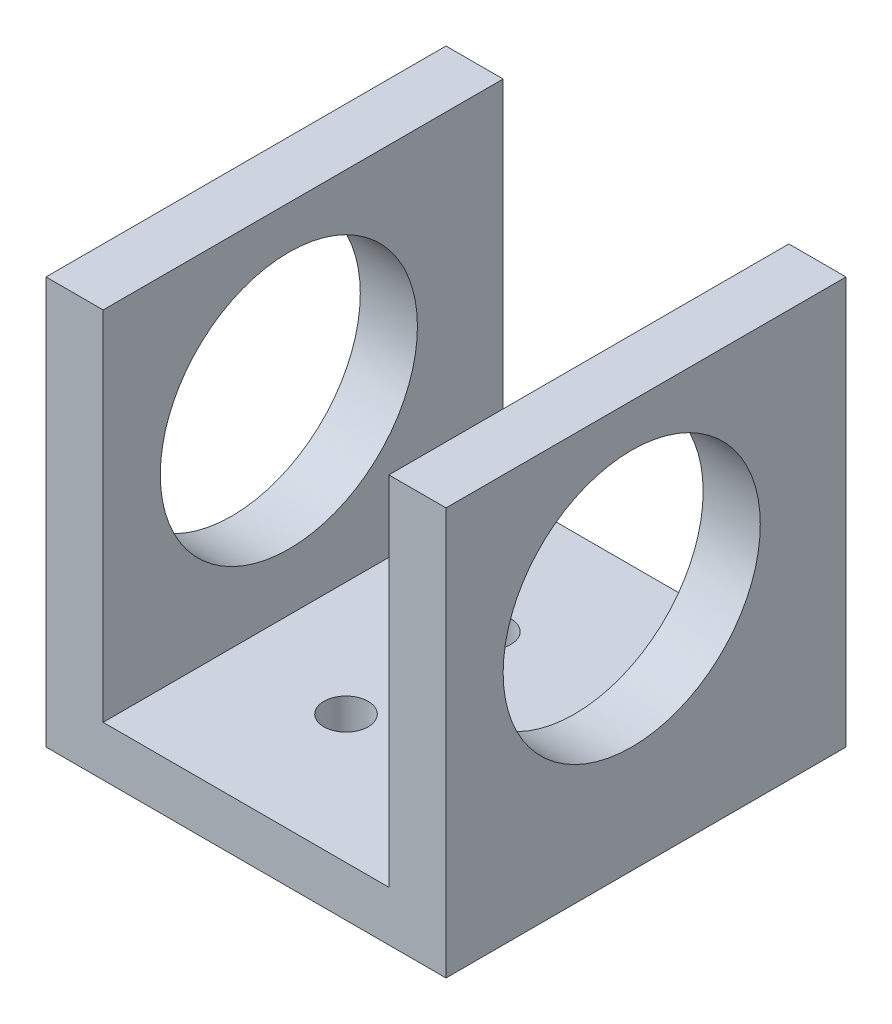
ISO-10303-21;
HEADER;
FILE_DESCRIPTION(('STEP AP214'),'2;1');
FILE_NAME('part.step','',(''),(''),'','','');
FILE_SCHEMA(('AUTOMOTIVE_DESIGN { 1 0 10303 214 1 1 1 1 }'));
ENDSEC;
DATA;
#1=APPLICATION_CONTEXT('core data for automotive mechanical design processes');
#2=APPLICATION_PROTOCOL_DEFINITION('international standard','automotive_design',2000,#1);
#3=PRODUCT_CONTEXT('',#1,'mechanical');
#4=PRODUCT('Part','Part','',(#3));
#5=PRODUCT_RELATED_PRODUCT_CATEGORY('part','',(#4));
#6=PRODUCT_DEFINITION_FORMATION('','',#4);
#7=PRODUCT_DEFINITION_CONTEXT('part definition',#1,'design');
#8=PRODUCT_DEFINITION('design','',#6,#7);
#9=PRODUCT_DEFINITION_SHAPE('','',#8);
#10=(LENGTH_UNIT() NAMED_UNIT(*) SI_UNIT(.MILLI.,.METRE.));
#11=(NAMED_UNIT(*) PLANE_ANGLE_UNIT() SI_UNIT($,.RADIAN.));
#12=(NAMED_UNIT(*) SI_UNIT($,.STERADIAN.) SOLID_ANGLE_UNIT());
#13=UNCERTAINTY_MEASURE_WITH_UNIT(LENGTH_MEASURE(1.E-05),#10,'distance_accuracy_value','');
#14=(GEOMETRIC_REPRESENTATION_CONTEXT(3) GLOBAL_UNCERTAINTY_ASSIGNED_CONTEXT((#13)) GLOBAL_UNIT_ASSIGNED_CONTEXT((#10,
#11,#12)) REPRESENTATION_CONTEXT('',''));
#15=CARTESIAN_POINT('',(0.,0.,0.));
#16=DIRECTION('',(0.,0.,1.));
#17=DIRECTION('',(1.,0.,0.));
#18=AXIS2_PLACEMENT_3D('',#15,#16,#17);
#19=CARTESIAN_POINT('',(0.,3.5,0.));
#20=DIRECTION('',(0.,1.,0.));
#21=DIRECTION('',(0.,0.,1.));
#22=AXIS2_PLACEMENT_3D('',#19,#20,#21);
#23=PLANE('',#22);
#24=CARTESIAN_POINT('',(12.,3.5,19.));
#25=DIRECTION('',(0.,1.,0.));
#26=DIRECTION('',(0.,0.,1.));
#27=AXIS2_PLACEMENT_3D('',#24,#25,#26);
#28=CIRCLE('',#27,1.55);
#29=CARTESIAN_POINT('',(12.,3.5,20.55));
#30=VERTEX_POINT('',#29);
#31=EDGE_CURVE('E178',#30,#30,#28,.T.);
#32=ORIENTED_EDGE('',*,*,#31,.F.);
#33=EDGE_LOOP('',(#32));
#34=FACE_BOUND('',#33,.T.);
#35=CARTESIAN_POINT('',(12.,3.5,9.));
#36=DIRECTION('',(0.,1.,0.));
#37=DIRECTION('',(0.,0.,1.));
#38=AXIS2_PLACEMENT_3D('',#35,#36,#37);
#39=CIRCLE('',#38,1.55);
#40=CARTESIAN_POINT('',(12.,3.5,10.55));
#41=VERTEX_POINT('',#40);
#42=EDGE_CURVE('E183',#41,#41,#39,.T.);
#43=ORIENTED_EDGE('',*,*,#42,.F.);
#44=EDGE_LOOP('',(#43));
#45=FACE_BOUND('',#44,.T.);
#46=DIRECTION('',(1.,0.,0.));
#47=VECTOR('',#46,1.);
#48=CARTESIAN_POINT('',(0.,3.5,28.));
#49=LINE('',#48,#47);
#50=CARTESIAN_POINT('',(4.,3.5,28.));
#51=VERTEX_POINT('',#50);
#52=CARTESIAN_POINT('',(24.,3.5,28.));
#53=VERTEX_POINT('',#52);
#54=EDGE_CURVE('E59',#51,#53,#49,.T.);
#55=ORIENTED_EDGE('',*,*,#54,.T.);
#56=DIRECTION('',(0.,0.,1.));
#57=VECTOR('',#56,1.);
#58=CARTESIAN_POINT('',(24.,3.5,0.));
#59=LINE('',#58,#57);
#60=CARTESIAN_POINT('',(24.,3.5,0.));
#61=VERTEX_POINT('',#60);
#62=EDGE_CURVE('E54',#61,#53,#59,.T.);
#63=ORIENTED_EDGE('',*,*,#62,.F.);
#64=DIRECTION('',(-1.,0.,0.));
#65=VECTOR('',#64,1.);
#66=CARTESIAN_POINT('',(0.,3.5,0.));
#67=LINE('',#66,#65);
#68=CARTESIAN_POINT('',(4.,3.5,0.));
#69=VERTEX_POINT('',#68);
#70=EDGE_CURVE('E160',#61,#69,#67,.T.);
#71=ORIENTED_EDGE('',*,*,#70,.T.);
#72=DIRECTION('',(0.,0.,-1.));
#73=VECTOR('',#72,1.);
#74=CARTESIAN_POINT('',(4.,3.5,0.));
#75=LINE('',#74,#73);
#76=EDGE_CURVE('E139',#51,#69,#75,.T.);
#77=ORIENTED_EDGE('',*,*,#76,.F.);
#78=EDGE_LOOP('',(#55,#63,#71,#77));
#79=FACE_BOUND('',#78,.T.);
#80=ADVANCED_FACE('F37',(#34,#45,#79),#23,.T.);
#81=CARTESIAN_POINT('',(0.,3.5,0.));
#82=DIRECTION('',(1.,0.,0.));
#83=DIRECTION('',(0.,0.,-1.));
#84=AXIS2_PLACEMENT_3D('',#81,#82,#83);
#85=PLANE('',#84);
#86=CARTESIAN_POINT('',(0.,16.5,15.));
#87=DIRECTION('',(-1.,0.,0.));
#88=DIRECTION('',(0.,0.,1.));
#89=AXIS2_PLACEMENT_3D('',#86,#87,#88);
#90=CIRCLE('',#89,9.);
#91=CARTESIAN_POINT('',(0.,16.5,24.));
#92=VERTEX_POINT('',#91);
#93=EDGE_CURVE('E175',#92,#92,#90,.T.);
#94=ORIENTED_EDGE('',*,*,#93,.F.);
#95=EDGE_LOOP('',(#94));
#96=FACE_BOUND('',#95,.T.);
#97=DIRECTION('',(0.,0.,1.));
#98=VECTOR('',#97,1.);
#99=CARTESIAN_POINT('',(0.,0.,0.));
#100=LINE('',#99,#98);
#101=CARTESIAN_POINT('',(0.,0.,0.));
#102=VERTEX_POINT('',#101);
#103=CARTESIAN_POINT('',(0.,0.,28.));
#104=VERTEX_POINT('',#103);
#105=EDGE_CURVE('E158',#102,#104,#100,.T.);
#106=ORIENTED_EDGE('',*,*,#105,.T.);
#107=DIRECTION('',(0.,-1.,0.));
#108=VECTOR('',#107,1.);
#109=CARTESIAN_POINT('',(0.,3.5,28.));
#110=LINE('',#109,#108);
#111=CARTESIAN_POINT('',(0.,28.5,28.));
#112=VERTEX_POINT('',#111);
#113=EDGE_CURVE('E11',#112,#104,#110,.T.);
#114=ORIENTED_EDGE('',*,*,#113,.F.);
#115=DIRECTION('',(0.,0.,1.));
#116=VECTOR('',#115,1.);
#117=CARTESIAN_POINT('',(0.,28.5,0.));
#118=LINE('',#117,#116);
#119=CARTESIAN_POINT('',(0.,28.5,0.));
#120=VERTEX_POINT('',#119);
#121=EDGE_CURVE('E140',#120,#112,#118,.T.);
#122=ORIENTED_EDGE('',*,*,#121,.F.);
#123=DIRECTION('',(0.,-1.,0.));
#124=VECTOR('',#123,1.);
#125=CARTESIAN_POINT('',(0.,3.5,0.));
#126=LINE('',#125,#124);
#127=EDGE_CURVE('E112',#120,#102,#126,.T.);
#128=ORIENTED_EDGE('',*,*,#127,.T.);
#129=EDGE_LOOP('',(#106,#114,#122,#128));
#130=FACE_BOUND('',#129,.T.);
#131=ADVANCED_FACE('F39',(#96,#130),#85,.F.);
#132=CARTESIAN_POINT('',(0.,3.5,28.));
#133=DIRECTION('',(0.,0.,-1.));
#134=DIRECTION('',(-1.,0.,0.));
#135=AXIS2_PLACEMENT_3D('',#132,#133,#134);
#136=PLANE('',#135);
#137=DIRECTION('',(1.,0.,0.));
#138=VECTOR('',#137,1.);
#139=CARTESIAN_POINT('',(0.,0.,28.));
#140=LINE('',#139,#138);
#141=CARTESIAN_POINT('',(28.,0.,28.));
#142=VERTEX_POINT('',#141);
#143=EDGE_CURVE('E165',#104,#142,#140,.T.);
#144=ORIENTED_EDGE('',*,*,#143,.T.);
#145=DIRECTION('',(0.,-1.,0.));
#146=VECTOR('',#145,1.);
#147=CARTESIAN_POINT('',(28.,3.5,28.));
#148=LINE('',#147,#146);
#149=CARTESIAN_POINT('',(28.,28.5,28.));
#150=VERTEX_POINT('',#149);
#151=EDGE_CURVE('E46',#150,#142,#148,.T.);
#152=ORIENTED_EDGE('',*,*,#151,.F.);
#153=DIRECTION('',(1.,0.,0.));
#154=VECTOR('',#153,1.);
#155=CARTESIAN_POINT('',(28.,28.5,28.));
#156=LINE('',#155,#154);
#157=CARTESIAN_POINT('',(24.,28.5,28.));
#158=VERTEX_POINT('',#157);
#159=EDGE_CURVE('E126',#158,#150,#156,.T.);
#160=ORIENTED_EDGE('',*,*,#159,.F.);
#161=DIRECTION('',(0.,-1.,0.));
#162=VECTOR('',#161,1.);
#163=CARTESIAN_POINT('',(24.,28.5,28.));
#164=LINE('',#163,#162);
#165=EDGE_CURVE('E134',#158,#53,#164,.T.);
#166=ORIENTED_EDGE('',*,*,#165,.T.);
#167=ORIENTED_EDGE('',*,*,#54,.F.);
#168=DIRECTION('',(0.,-1.,0.));
#169=VECTOR('',#168,1.);
#170=CARTESIAN_POINT('',(4.,28.5,28.));
#171=LINE('',#170,#169);
#172=CARTESIAN_POINT('',(4.,28.5,28.));
#173=VERTEX_POINT('',#172);
#174=EDGE_CURVE('E155',#173,#51,#171,.T.);
#175=ORIENTED_EDGE('',*,*,#174,.F.);
#176=DIRECTION('',(1.,0.,0.));
#177=VECTOR('',#176,1.);
#178=CARTESIAN_POINT('',(0.,28.5,28.));
#179=LINE('',#178,#177);
#180=EDGE_CURVE('E143',#112,#173,#179,.T.);
#181=ORIENTED_EDGE('',*,*,#180,.F.);
#182=ORIENTED_EDGE('',*,*,#113,.T.);
#183=EDGE_LOOP('',(#144,#152,#160,#166,#167,#175,#181,#182));
#184=FACE_BOUND('',#183,.T.);
#185=ADVANCED_FACE('F219',(#184),#136,.F.);
#186=CARTESIAN_POINT('',(28.,3.5,0.));
#187=DIRECTION('',(-1.,0.,0.));
#188=DIRECTION('',(0.,0.,1.));
#189=AXIS2_PLACEMENT_3D('',#186,#187,#188);
#190=PLANE('',#189);
#191=CARTESIAN_POINT('',(28.,16.5,15.));
#192=DIRECTION('',(-1.,0.,0.));
#193=DIRECTION('',(0.,0.,1.));
#194=AXIS2_PLACEMENT_3D('',#191,#192,#193);
#195=CIRCLE('',#194,9.);
#196=CARTESIAN_POINT('',(28.,16.5,24.));
#197=VERTEX_POINT('',#196);
#198=EDGE_CURVE('E128',#197,#197,#195,.T.);
#199=ORIENTED_EDGE('',*,*,#198,.T.);
#200=EDGE_LOOP('',(#199));
#201=FACE_BOUND('',#200,.T.);
#202=DIRECTION('',(0.,0.,-1.));
#203=VECTOR('',#202,1.);
#204=CARTESIAN_POINT('',(28.,0.,0.));
#205=LINE('',#204,#203);
#206=CARTESIAN_POINT('',(28.,0.,0.));
#207=VERTEX_POINT('',#206);
#208=EDGE_CURVE('E109',#142,#207,#205,.T.);
#209=ORIENTED_EDGE('',*,*,#208,.T.);
#210=DIRECTION('',(0.,-1.,0.));
#211=VECTOR('',#210,1.);
#212=CARTESIAN_POINT('',(28.,3.5,0.));
#213=LINE('',#212,#211);
#214=CARTESIAN_POINT('',(28.,28.5,0.));
#215=VERTEX_POINT('',#214);
#216=EDGE_CURVE('E102',#215,#207,#213,.T.);
#217=ORIENTED_EDGE('',*,*,#216,.F.);
#218=DIRECTION('',(0.,0.,-1.));
#219=VECTOR('',#218,1.);
#220=CARTESIAN_POINT('',(28.,28.5,0.));
#221=LINE('',#220,#219);
#222=EDGE_CURVE('E107',#150,#215,#221,.T.);
#223=ORIENTED_EDGE('',*,*,#222,.F.);
#224=ORIENTED_EDGE('',*,*,#151,.T.);
#225=EDGE_LOOP('',(#209,#217,#223,#224));
#226=FACE_BOUND('',#225,.T.);
#227=ADVANCED_FACE('F104',(#201,#226),#190,.F.);
#228=CARTESIAN_POINT('',(0.,3.5,0.));
#229=DIRECTION('',(0.,0.,1.));
#230=DIRECTION('',(1.,0.,0.));
#231=AXIS2_PLACEMENT_3D('',#228,#229,#230);
#232=PLANE('',#231);
#233=DIRECTION('',(-1.,0.,0.));
#234=VECTOR('',#233,1.);
#235=CARTESIAN_POINT('',(0.,0.,0.));
#236=LINE('',#235,#234);
#237=EDGE_CURVE('E161',#207,#102,#236,.T.);
#238=ORIENTED_EDGE('',*,*,#237,.T.);
#239=ORIENTED_EDGE('',*,*,#127,.F.);
#240=DIRECTION('',(-1.,0.,0.));
#241=VECTOR('',#240,1.);
#242=CARTESIAN_POINT('',(0.,28.5,0.));
#243=LINE('',#242,#241);
#244=CARTESIAN_POINT('',(4.,28.5,0.));
#245=VERTEX_POINT('',#244);
#246=EDGE_CURVE('E147',#245,#120,#243,.T.);
#247=ORIENTED_EDGE('',*,*,#246,.F.);
#248=DIRECTION('',(0.,-1.,0.));
#249=VECTOR('',#248,1.);
#250=CARTESIAN_POINT('',(4.,28.5,0.));
#251=LINE('',#250,#249);
#252=EDGE_CURVE('E150',#245,#69,#251,.T.);
#253=ORIENTED_EDGE('',*,*,#252,.T.);
#254=ORIENTED_EDGE('',*,*,#70,.F.);
#255=DIRECTION('',(0.,-1.,0.));
#256=VECTOR('',#255,1.);
#257=CARTESIAN_POINT('',(24.,28.5,0.));
#258=LINE('',#257,#256);
#259=CARTESIAN_POINT('',(24.,28.5,0.));
#260=VERTEX_POINT('',#259);
#261=EDGE_CURVE('E118',#260,#61,#258,.T.);
#262=ORIENTED_EDGE('',*,*,#261,.F.);
#263=DIRECTION('',(-1.,0.,0.));
#264=VECTOR('',#263,1.);
#265=CARTESIAN_POINT('',(28.,28.5,0.));
#266=LINE('',#265,#264);
#267=EDGE_CURVE('E115',#215,#260,#266,.T.);
#268=ORIENTED_EDGE('',*,*,#267,.F.);
#269=ORIENTED_EDGE('',*,*,#216,.T.);
#270=EDGE_LOOP('',(#238,#239,#247,#253,#254,#262,#268,#269));
#271=FACE_BOUND('',#270,.T.);
#272=ADVANCED_FACE('F116',(#271),#232,.F.);
#273=CARTESIAN_POINT('',(0.,0.,0.));
#274=DIRECTION('',(0.,1.,0.));
#275=DIRECTION('',(0.,0.,1.));
#276=AXIS2_PLACEMENT_3D('',#273,#274,#275);
#277=PLANE('',#276);
#278=CARTESIAN_POINT('',(12.,0.,19.));
#279=DIRECTION('',(0.,1.,0.));
#280=DIRECTION('',(0.,0.,1.));
#281=AXIS2_PLACEMENT_3D('',#278,#279,#280);
#282=CIRCLE('',#281,1.55);
#283=CARTESIAN_POINT('',(12.,0.,20.55));
#284=VERTEX_POINT('',#283);
#285=EDGE_CURVE('E41',#284,#284,#282,.T.);
#286=ORIENTED_EDGE('',*,*,#285,.T.);
#287=EDGE_LOOP('',(#286));
#288=FACE_BOUND('',#287,.T.);
#289=CARTESIAN_POINT('',(12.,0.,9.));
#290=DIRECTION('',(0.,1.,0.));
#291=DIRECTION('',(0.,0.,1.));
#292=AXIS2_PLACEMENT_3D('',#289,#290,#291);
#293=CIRCLE('',#292,1.55);
#294=CARTESIAN_POINT('',(12.,0.,10.55));
#295=VERTEX_POINT('',#294);
#296=EDGE_CURVE('E176',#295,#295,#293,.T.);
#297=ORIENTED_EDGE('',*,*,#296,.T.);
#298=EDGE_LOOP('',(#297));
#299=FACE_BOUND('',#298,.T.);
#300=ORIENTED_EDGE('',*,*,#105,.F.);
#301=ORIENTED_EDGE('',*,*,#237,.F.);
#302=ORIENTED_EDGE('',*,*,#208,.F.);
#303=ORIENTED_EDGE('',*,*,#143,.F.);
#304=EDGE_LOOP('',(#300,#301,#302,#303));
#305=FACE_BOUND('',#304,.T.);
#306=ADVANCED_FACE('F226',(#288,#299,#305),#277,.F.);
#307=CARTESIAN_POINT('',(4.,28.5,0.));
#308=DIRECTION('',(-1.,0.,0.));
#309=DIRECTION('',(0.,0.,1.));
#310=AXIS2_PLACEMENT_3D('',#307,#308,#309);
#311=PLANE('',#310);
#312=CARTESIAN_POINT('',(4.,16.5,15.));
#313=DIRECTION('',(-1.,0.,0.));
#314=DIRECTION('',(0.,0.,1.));
#315=AXIS2_PLACEMENT_3D('',#312,#313,#314);
#316=CIRCLE('',#315,9.);
#317=CARTESIAN_POINT('',(4.,16.5,24.));
#318=VERTEX_POINT('',#317);
#319=EDGE_CURVE('E174',#318,#318,#316,.T.);
#320=ORIENTED_EDGE('',*,*,#319,.T.);
#321=EDGE_LOOP('',(#320));
#322=FACE_BOUND('',#321,.T.);
#323=ORIENTED_EDGE('',*,*,#76,.T.);
#324=ORIENTED_EDGE('',*,*,#252,.F.);
#325=DIRECTION('',(0.,0.,-1.));
#326=VECTOR('',#325,1.);
#327=CARTESIAN_POINT('',(4.,28.5,0.));
#328=LINE('',#327,#326);
#329=EDGE_CURVE('E145',#173,#245,#328,.T.);
#330=ORIENTED_EDGE('',*,*,#329,.F.);
#331=ORIENTED_EDGE('',*,*,#174,.T.);
#332=EDGE_LOOP('',(#323,#324,#330,#331));
#333=FACE_BOUND('',#332,.T.);
#334=ADVANCED_FACE('F224',(#322,#333),#311,.F.);
#335=CARTESIAN_POINT('',(0.,28.5,0.));
#336=DIRECTION('',(0.,1.,0.));
#337=DIRECTION('',(0.,0.,1.));
#338=AXIS2_PLACEMENT_3D('',#335,#336,#337);
#339=PLANE('',#338);
#340=ORIENTED_EDGE('',*,*,#121,.T.);
#341=ORIENTED_EDGE('',*,*,#180,.T.);
#342=ORIENTED_EDGE('',*,*,#329,.T.);
#343=ORIENTED_EDGE('',*,*,#246,.T.);
#344=EDGE_LOOP('',(#340,#341,#342,#343));
#345=FACE_BOUND('',#344,.T.);
#346=ADVANCED_FACE('F244',(#345),#339,.T.);
#347=CARTESIAN_POINT('',(24.,28.5,0.));
#348=DIRECTION('',(1.,0.,0.));
#349=DIRECTION('',(0.,0.,-1.));
#350=AXIS2_PLACEMENT_3D('',#347,#348,#349);
#351=PLANE('',#350);
#352=CARTESIAN_POINT('',(24.,16.5,15.));
#353=DIRECTION('',(1.,0.,0.));
#354=DIRECTION('',(0.,0.,-1.));
#355=AXIS2_PLACEMENT_3D('',#352,#353,#354);
#356=CIRCLE('',#355,9.);
#357=CARTESIAN_POINT('',(24.,16.5,5.99999999999999));
#358=VERTEX_POINT('',#357);
#359=EDGE_CURVE('E172',#358,#358,#356,.T.);
#360=ORIENTED_EDGE('',*,*,#359,.T.);
#361=EDGE_LOOP('',(#360));
#362=FACE_BOUND('',#361,.T.);
#363=ORIENTED_EDGE('',*,*,#62,.T.);
#364=ORIENTED_EDGE('',*,*,#165,.F.);
#365=DIRECTION('',(0.,0.,1.));
#366=VECTOR('',#365,1.);
#367=CARTESIAN_POINT('',(24.,28.5,0.));
#368=LINE('',#367,#366);
#369=EDGE_CURVE('E121',#260,#158,#368,.T.);
#370=ORIENTED_EDGE('',*,*,#369,.F.);
#371=ORIENTED_EDGE('',*,*,#261,.T.);
#372=EDGE_LOOP('',(#363,#364,#370,#371));
#373=FACE_BOUND('',#372,.T.);
#374=ADVANCED_FACE('F209',(#362,#373),#351,.F.);
#375=CARTESIAN_POINT('',(0.,28.5,0.));
#376=DIRECTION('',(0.,-1.,0.));
#377=DIRECTION('',(0.,0.,-1.));
#378=AXIS2_PLACEMENT_3D('',#375,#376,#377);
#379=PLANE('',#378);
#380=ORIENTED_EDGE('',*,*,#222,.T.);
#381=ORIENTED_EDGE('',*,*,#267,.T.);
#382=ORIENTED_EDGE('',*,*,#369,.T.);
#383=ORIENTED_EDGE('',*,*,#159,.T.);
#384=EDGE_LOOP('',(#380,#381,#382,#383));
#385=FACE_BOUND('',#384,.T.);
#386=ADVANCED_FACE('F124',(#385),#379,.F.);
#387=CARTESIAN_POINT('',(50.,16.5,15.));
#388=DIRECTION('',(-1.,0.,0.));
#389=DIRECTION('',(0.,0.,1.));
#390=AXIS2_PLACEMENT_3D('',#387,#388,#389);
#391=CYLINDRICAL_SURFACE('',#390,9.);
#392=ORIENTED_EDGE('',*,*,#359,.F.);
#393=EDGE_LOOP('',(#392));
#394=FACE_BOUND('',#393,.T.);
#395=ORIENTED_EDGE('',*,*,#198,.F.);
#396=EDGE_LOOP('',(#395));
#397=FACE_BOUND('',#396,.T.);
#398=ADVANCED_FACE('F198',(#394,#397),#391,.F.);
#399=ORIENTED_EDGE('',*,*,#93,.T.);
#400=EDGE_LOOP('',(#399));
#401=FACE_BOUND('',#400,.T.);
#402=ORIENTED_EDGE('',*,*,#319,.F.);
#403=EDGE_LOOP('',(#402));
#404=FACE_BOUND('',#403,.T.);
#405=ADVANCED_FACE('F200',(#401,#404),#391,.F.);
#406=CARTESIAN_POINT('',(12.,-46.5,9.));
#407=DIRECTION('',(0.,1.,0.));
#408=DIRECTION('',(0.,0.,1.));
#409=AXIS2_PLACEMENT_3D('',#406,#407,#408);
#410=CYLINDRICAL_SURFACE('',#409,1.55);
#411=ORIENTED_EDGE('',*,*,#42,.T.);
#412=EDGE_LOOP('',(#411));
#413=FACE_BOUND('',#412,.T.);
#414=ORIENTED_EDGE('',*,*,#296,.F.);
#415=EDGE_LOOP('',(#414));
#416=FACE_BOUND('',#415,.T.);
#417=ADVANCED_FACE('F207',(#413,#416),#410,.F.);
#418=CARTESIAN_POINT('',(12.,-46.5,19.));
#419=DIRECTION('',(0.,1.,0.));
#420=DIRECTION('',(0.,0.,1.));
#421=AXIS2_PLACEMENT_3D('',#418,#419,#420);
#422=CYLINDRICAL_SURFACE('',#421,1.55);
#423=ORIENTED_EDGE('',*,*,#31,.T.);
#424=EDGE_LOOP('',(#423));
#425=FACE_BOUND('',#424,.T.);
#426=ORIENTED_EDGE('',*,*,#285,.F.);
#427=EDGE_LOOP('',(#426));
#428=FACE_BOUND('',#427,.T.);
#429=ADVANCED_FACE('F345',(#425,#428),#422,.F.);
#430=CLOSED_SHELL('',(#80,#131,#185,#227,#272,#306,#334,#346,#374,#386,#398,#405,#417,#429));
#431=MANIFOLD_SOLID_BREP('B2',#430);
#432=ADVANCED_BREP_SHAPE_REPRESENTATION('',(#18,#431),#14);
#433=SHAPE_DEFINITION_REPRESENTATION(#9,#432);
ENDSEC;
END-ISO-10303-21;
